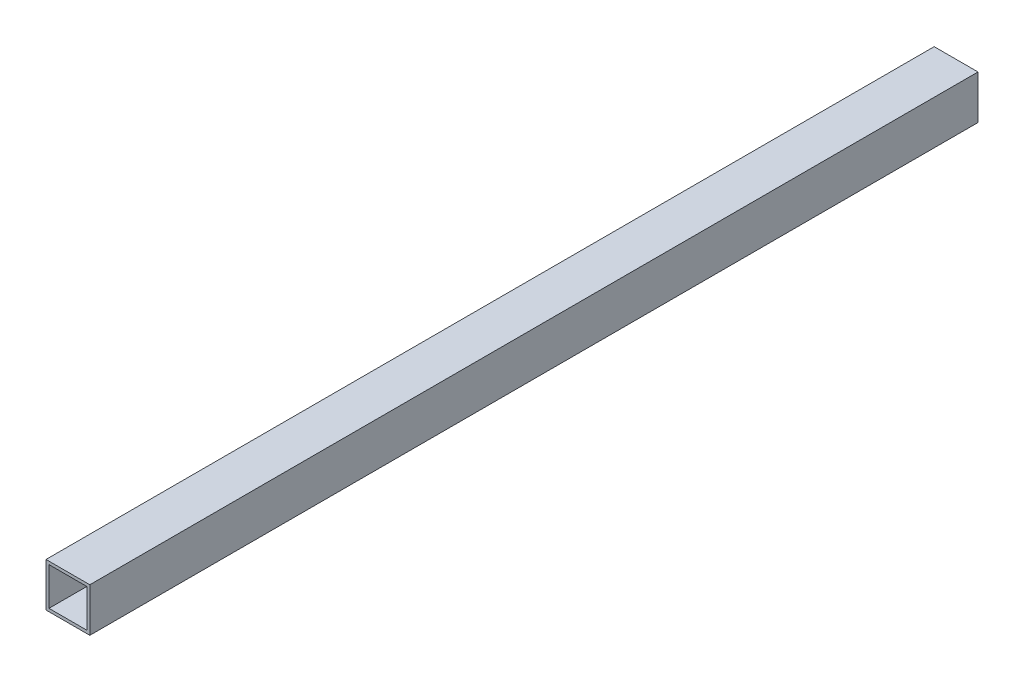
ISO-10303-21;
HEADER;
FILE_DESCRIPTION(('STEP AP214'),'2;1');
FILE_NAME('part.step','',(''),(''),'','','');
FILE_SCHEMA(('AUTOMOTIVE_DESIGN { 1 0 10303 214 1 1 1 1 }'));
ENDSEC;
DATA;
#1=APPLICATION_CONTEXT('core data for automotive mechanical design processes');
#2=APPLICATION_PROTOCOL_DEFINITION('international standard','automotive_design',2000,#1);
#3=PRODUCT_CONTEXT('',#1,'mechanical');
#4=PRODUCT('Part','Part','',(#3));
#5=PRODUCT_RELATED_PRODUCT_CATEGORY('part','',(#4));
#6=PRODUCT_DEFINITION_FORMATION('','',#4);
#7=PRODUCT_DEFINITION_CONTEXT('part definition',#1,'design');
#8=PRODUCT_DEFINITION('design','',#6,#7);
#9=PRODUCT_DEFINITION_SHAPE('','',#8);
#10=(LENGTH_UNIT() NAMED_UNIT(*) SI_UNIT(.MILLI.,.METRE.));
#11=(NAMED_UNIT(*) PLANE_ANGLE_UNIT() SI_UNIT($,.RADIAN.));
#12=(NAMED_UNIT(*) SI_UNIT($,.STERADIAN.) SOLID_ANGLE_UNIT());
#13=UNCERTAINTY_MEASURE_WITH_UNIT(LENGTH_MEASURE(1.E-05),#10,'distance_accuracy_value','');
#14=(GEOMETRIC_REPRESENTATION_CONTEXT(3) GLOBAL_UNCERTAINTY_ASSIGNED_CONTEXT((#13)) GLOBAL_UNIT_ASSIGNED_CONTEXT((#10,
#11,#12)) REPRESENTATION_CONTEXT('',''));
#15=CARTESIAN_POINT('',(0.,0.,0.));
#16=DIRECTION('',(0.,0.,1.));
#17=DIRECTION('',(1.,0.,0.));
#18=AXIS2_PLACEMENT_3D('',#15,#16,#17);
#19=CARTESIAN_POINT('',(0.,0.,300.));
#20=DIRECTION('',(0.,0.,-1.));
#21=DIRECTION('',(-1.,0.,0.));
#22=AXIS2_PLACEMENT_3D('',#19,#20,#21);
#23=PLANE('',#22);
#24=DIRECTION('',(0.,1.,0.));
#25=VECTOR('',#24,1.);
#26=CARTESIAN_POINT('',(7.4,-7.4,300.));
#27=LINE('',#26,#25);
#28=CARTESIAN_POINT('',(7.4,-7.4,300.));
#29=VERTEX_POINT('',#28);
#30=CARTESIAN_POINT('',(7.4,7.4,300.));
#31=VERTEX_POINT('',#30);
#32=EDGE_CURVE('E159',#29,#31,#27,.T.);
#33=ORIENTED_EDGE('',*,*,#32,.T.);
#34=DIRECTION('',(-1.,0.,0.));
#35=VECTOR('',#34,1.);
#36=CARTESIAN_POINT('',(-7.4,7.4,300.));
#37=LINE('',#36,#35);
#38=CARTESIAN_POINT('',(-7.4,7.4,300.));
#39=VERTEX_POINT('',#38);
#40=EDGE_CURVE('E163',#31,#39,#37,.T.);
#41=ORIENTED_EDGE('',*,*,#40,.T.);
#42=DIRECTION('',(0.,-1.,0.));
#43=VECTOR('',#42,1.);
#44=CARTESIAN_POINT('',(-7.4,-7.4,300.));
#45=LINE('',#44,#43);
#46=CARTESIAN_POINT('',(-7.4,-7.4,300.));
#47=VERTEX_POINT('',#46);
#48=EDGE_CURVE('E167',#39,#47,#45,.T.);
#49=ORIENTED_EDGE('',*,*,#48,.T.);
#50=DIRECTION('',(1.,0.,0.));
#51=VECTOR('',#50,1.);
#52=CARTESIAN_POINT('',(-7.4,-7.4,300.));
#53=LINE('',#52,#51);
#54=EDGE_CURVE('E170',#47,#29,#53,.T.);
#55=ORIENTED_EDGE('',*,*,#54,.T.);
#56=EDGE_LOOP('',(#33,#41,#49,#55));
#57=FACE_BOUND('',#56,.T.);
#58=DIRECTION('',(0.,-1.,0.));
#59=VECTOR('',#58,1.);
#60=CARTESIAN_POINT('',(-6.4,-6.4,300.));
#61=LINE('',#60,#59);
#62=CARTESIAN_POINT('',(-6.4,6.4,300.));
#63=VERTEX_POINT('',#62);
#64=CARTESIAN_POINT('',(-6.4,-6.4,300.));
#65=VERTEX_POINT('',#64);
#66=EDGE_CURVE('E111',#63,#65,#61,.T.);
#67=ORIENTED_EDGE('',*,*,#66,.F.);
#68=DIRECTION('',(-1.,0.,0.));
#69=VECTOR('',#68,1.);
#70=CARTESIAN_POINT('',(-6.4,6.4,300.));
#71=LINE('',#70,#69);
#72=CARTESIAN_POINT('',(6.4,6.4,300.));
#73=VERTEX_POINT('',#72);
#74=EDGE_CURVE('E137',#73,#63,#71,.T.);
#75=ORIENTED_EDGE('',*,*,#74,.F.);
#76=DIRECTION('',(0.,1.,0.));
#77=VECTOR('',#76,1.);
#78=CARTESIAN_POINT('',(6.4,-6.4,300.));
#79=LINE('',#78,#77);
#80=CARTESIAN_POINT('',(6.4,-6.4,300.));
#81=VERTEX_POINT('',#80);
#82=EDGE_CURVE('E133',#81,#73,#79,.T.);
#83=ORIENTED_EDGE('',*,*,#82,.F.);
#84=DIRECTION('',(1.,0.,0.));
#85=VECTOR('',#84,1.);
#86=CARTESIAN_POINT('',(-6.4,-6.4,300.));
#87=LINE('',#86,#85);
#88=EDGE_CURVE('E120',#65,#81,#87,.T.);
#89=ORIENTED_EDGE('',*,*,#88,.F.);
#90=EDGE_LOOP('',(#67,#75,#83,#89));
#91=FACE_BOUND('',#90,.T.);
#92=ADVANCED_FACE('F45',(#57,#91),#23,.F.);
#93=CARTESIAN_POINT('',(0.,0.,0.));
#94=DIRECTION('',(0.,0.,-1.));
#95=DIRECTION('',(-1.,0.,0.));
#96=AXIS2_PLACEMENT_3D('',#93,#94,#95);
#97=PLANE('',#96);
#98=DIRECTION('',(0.,1.,0.));
#99=VECTOR('',#98,1.);
#100=CARTESIAN_POINT('',(7.4,-7.4,0.));
#101=LINE('',#100,#99);
#102=CARTESIAN_POINT('',(7.4,-7.4,0.));
#103=VERTEX_POINT('',#102);
#104=CARTESIAN_POINT('',(7.4,7.4,0.));
#105=VERTEX_POINT('',#104);
#106=EDGE_CURVE('E129',#103,#105,#101,.T.);
#107=ORIENTED_EDGE('',*,*,#106,.F.);
#108=DIRECTION('',(1.,0.,0.));
#109=VECTOR('',#108,1.);
#110=CARTESIAN_POINT('',(-7.4,-7.4,0.));
#111=LINE('',#110,#109);
#112=CARTESIAN_POINT('',(-7.4,-7.4,0.));
#113=VERTEX_POINT('',#112);
#114=EDGE_CURVE('E164',#113,#103,#111,.T.);
#115=ORIENTED_EDGE('',*,*,#114,.F.);
#116=DIRECTION('',(0.,-1.,0.));
#117=VECTOR('',#116,1.);
#118=CARTESIAN_POINT('',(-7.4,-7.4,0.));
#119=LINE('',#118,#117);
#120=CARTESIAN_POINT('',(-7.4,7.4,0.));
#121=VERTEX_POINT('',#120);
#122=EDGE_CURVE('E180',#121,#113,#119,.T.);
#123=ORIENTED_EDGE('',*,*,#122,.F.);
#124=DIRECTION('',(-1.,0.,0.));
#125=VECTOR('',#124,1.);
#126=CARTESIAN_POINT('',(-7.4,7.4,0.));
#127=LINE('',#126,#125);
#128=EDGE_CURVE('E177',#105,#121,#127,.T.);
#129=ORIENTED_EDGE('',*,*,#128,.F.);
#130=EDGE_LOOP('',(#107,#115,#123,#129));
#131=FACE_BOUND('',#130,.T.);
#132=DIRECTION('',(-1.,0.,0.));
#133=VECTOR('',#132,1.);
#134=CARTESIAN_POINT('',(-6.4,6.4,0.));
#135=LINE('',#134,#133);
#136=CARTESIAN_POINT('',(6.4,6.4,0.));
#137=VERTEX_POINT('',#136);
#138=CARTESIAN_POINT('',(-6.4,6.4,0.));
#139=VERTEX_POINT('',#138);
#140=EDGE_CURVE('E121',#137,#139,#135,.T.);
#141=ORIENTED_EDGE('',*,*,#140,.T.);
#142=DIRECTION('',(0.,-1.,0.));
#143=VECTOR('',#142,1.);
#144=CARTESIAN_POINT('',(-6.4,-6.4,0.));
#145=LINE('',#144,#143);
#146=CARTESIAN_POINT('',(-6.4,-6.4,0.));
#147=VERTEX_POINT('',#146);
#148=EDGE_CURVE('E69',#139,#147,#145,.T.);
#149=ORIENTED_EDGE('',*,*,#148,.T.);
#150=DIRECTION('',(1.,0.,0.));
#151=VECTOR('',#150,1.);
#152=CARTESIAN_POINT('',(-6.4,-6.4,0.));
#153=LINE('',#152,#151);
#154=CARTESIAN_POINT('',(6.4,-6.4,0.));
#155=VERTEX_POINT('',#154);
#156=EDGE_CURVE('E127',#147,#155,#153,.T.);
#157=ORIENTED_EDGE('',*,*,#156,.T.);
#158=DIRECTION('',(0.,1.,0.));
#159=VECTOR('',#158,1.);
#160=CARTESIAN_POINT('',(6.4,-6.4,0.));
#161=LINE('',#160,#159);
#162=EDGE_CURVE('E146',#155,#137,#161,.T.);
#163=ORIENTED_EDGE('',*,*,#162,.T.);
#164=EDGE_LOOP('',(#141,#149,#157,#163));
#165=FACE_BOUND('',#164,.T.);
#166=ADVANCED_FACE('F203',(#131,#165),#97,.T.);
#167=CARTESIAN_POINT('',(7.4,-7.4,300.));
#168=DIRECTION('',(-1.,0.,0.));
#169=DIRECTION('',(0.,0.,1.));
#170=AXIS2_PLACEMENT_3D('',#167,#168,#169);
#171=PLANE('',#170);
#172=ORIENTED_EDGE('',*,*,#106,.T.);
#173=DIRECTION('',(0.,0.,-1.));
#174=VECTOR('',#173,1.);
#175=CARTESIAN_POINT('',(7.4,7.4,300.));
#176=LINE('',#175,#174);
#177=EDGE_CURVE('E11',#31,#105,#176,.T.);
#178=ORIENTED_EDGE('',*,*,#177,.F.);
#179=ORIENTED_EDGE('',*,*,#32,.F.);
#180=DIRECTION('',(0.,0.,-1.));
#181=VECTOR('',#180,1.);
#182=CARTESIAN_POINT('',(7.4,-7.4,300.));
#183=LINE('',#182,#181);
#184=EDGE_CURVE('E173',#29,#103,#183,.T.);
#185=ORIENTED_EDGE('',*,*,#184,.T.);
#186=EDGE_LOOP('',(#172,#178,#179,#185));
#187=FACE_BOUND('',#186,.T.);
#188=ADVANCED_FACE('F47',(#187),#171,.F.);
#189=CARTESIAN_POINT('',(-7.4,7.4,300.));
#190=DIRECTION('',(0.,-1.,0.));
#191=DIRECTION('',(0.,0.,-1.));
#192=AXIS2_PLACEMENT_3D('',#189,#190,#191);
#193=PLANE('',#192);
#194=ORIENTED_EDGE('',*,*,#128,.T.);
#195=DIRECTION('',(0.,0.,-1.));
#196=VECTOR('',#195,1.);
#197=CARTESIAN_POINT('',(-7.4,7.4,300.));
#198=LINE('',#197,#196);
#199=EDGE_CURVE('E54',#39,#121,#198,.T.);
#200=ORIENTED_EDGE('',*,*,#199,.F.);
#201=ORIENTED_EDGE('',*,*,#40,.F.);
#202=ORIENTED_EDGE('',*,*,#177,.T.);
#203=EDGE_LOOP('',(#194,#200,#201,#202));
#204=FACE_BOUND('',#203,.T.);
#205=ADVANCED_FACE('F213',(#204),#193,.F.);
#206=CARTESIAN_POINT('',(-7.4,-7.4,300.));
#207=DIRECTION('',(1.,0.,0.));
#208=DIRECTION('',(0.,0.,-1.));
#209=AXIS2_PLACEMENT_3D('',#206,#207,#208);
#210=PLANE('',#209);
#211=ORIENTED_EDGE('',*,*,#122,.T.);
#212=DIRECTION('',(0.,0.,-1.));
#213=VECTOR('',#212,1.);
#214=CARTESIAN_POINT('',(-7.4,-7.4,300.));
#215=LINE('',#214,#213);
#216=EDGE_CURVE('E188',#47,#113,#215,.T.);
#217=ORIENTED_EDGE('',*,*,#216,.F.);
#218=ORIENTED_EDGE('',*,*,#48,.F.);
#219=ORIENTED_EDGE('',*,*,#199,.T.);
#220=EDGE_LOOP('',(#211,#217,#218,#219));
#221=FACE_BOUND('',#220,.T.);
#222=ADVANCED_FACE('F197',(#221),#210,.F.);
#223=CARTESIAN_POINT('',(-7.4,-7.4,300.));
#224=DIRECTION('',(0.,1.,0.));
#225=DIRECTION('',(0.,0.,1.));
#226=AXIS2_PLACEMENT_3D('',#223,#224,#225);
#227=PLANE('',#226);
#228=ORIENTED_EDGE('',*,*,#114,.T.);
#229=ORIENTED_EDGE('',*,*,#184,.F.);
#230=ORIENTED_EDGE('',*,*,#54,.F.);
#231=ORIENTED_EDGE('',*,*,#216,.T.);
#232=EDGE_LOOP('',(#228,#229,#230,#231));
#233=FACE_BOUND('',#232,.T.);
#234=ADVANCED_FACE('F207',(#233),#227,.F.);
#235=CARTESIAN_POINT('',(-6.4,-6.4,300.));
#236=DIRECTION('',(1.,0.,0.));
#237=DIRECTION('',(0.,0.,-1.));
#238=AXIS2_PLACEMENT_3D('',#235,#236,#237);
#239=PLANE('',#238);
#240=ORIENTED_EDGE('',*,*,#148,.F.);
#241=DIRECTION('',(0.,0.,-1.));
#242=VECTOR('',#241,1.);
#243=CARTESIAN_POINT('',(-6.4,6.4,300.));
#244=LINE('',#243,#242);
#245=EDGE_CURVE('E115',#63,#139,#244,.T.);
#246=ORIENTED_EDGE('',*,*,#245,.F.);
#247=ORIENTED_EDGE('',*,*,#66,.T.);
#248=DIRECTION('',(0.,0.,-1.));
#249=VECTOR('',#248,1.);
#250=CARTESIAN_POINT('',(-6.4,-6.4,300.));
#251=LINE('',#250,#249);
#252=EDGE_CURVE('E114',#65,#147,#251,.T.);
#253=ORIENTED_EDGE('',*,*,#252,.T.);
#254=EDGE_LOOP('',(#240,#246,#247,#253));
#255=FACE_BOUND('',#254,.T.);
#256=ADVANCED_FACE('F113',(#255),#239,.T.);
#257=CARTESIAN_POINT('',(-6.4,-6.4,300.));
#258=DIRECTION('',(0.,1.,0.));
#259=DIRECTION('',(0.,0.,1.));
#260=AXIS2_PLACEMENT_3D('',#257,#258,#259);
#261=PLANE('',#260);
#262=ORIENTED_EDGE('',*,*,#156,.F.);
#263=ORIENTED_EDGE('',*,*,#252,.F.);
#264=ORIENTED_EDGE('',*,*,#88,.T.);
#265=DIRECTION('',(0.,0.,-1.));
#266=VECTOR('',#265,1.);
#267=CARTESIAN_POINT('',(6.4,-6.4,300.));
#268=LINE('',#267,#266);
#269=EDGE_CURVE('E130',#81,#155,#268,.T.);
#270=ORIENTED_EDGE('',*,*,#269,.T.);
#271=EDGE_LOOP('',(#262,#263,#264,#270));
#272=FACE_BOUND('',#271,.T.);
#273=ADVANCED_FACE('F124',(#272),#261,.T.);
#274=CARTESIAN_POINT('',(6.4,-6.4,300.));
#275=DIRECTION('',(-1.,0.,0.));
#276=DIRECTION('',(0.,-1.,0.));
#277=AXIS2_PLACEMENT_3D('',#274,#275,#276);
#278=PLANE('',#277);
#279=ORIENTED_EDGE('',*,*,#162,.F.);
#280=ORIENTED_EDGE('',*,*,#269,.F.);
#281=ORIENTED_EDGE('',*,*,#82,.T.);
#282=DIRECTION('',(0.,0.,-1.));
#283=VECTOR('',#282,1.);
#284=CARTESIAN_POINT('',(6.4,6.4,300.));
#285=LINE('',#284,#283);
#286=EDGE_CURVE('E61',#73,#137,#285,.T.);
#287=ORIENTED_EDGE('',*,*,#286,.T.);
#288=EDGE_LOOP('',(#279,#280,#281,#287));
#289=FACE_BOUND('',#288,.T.);
#290=ADVANCED_FACE('F236',(#289),#278,.T.);
#291=CARTESIAN_POINT('',(-6.4,6.4,300.));
#292=DIRECTION('',(0.,-1.,0.));
#293=DIRECTION('',(1.,0.,0.));
#294=AXIS2_PLACEMENT_3D('',#291,#292,#293);
#295=PLANE('',#294);
#296=ORIENTED_EDGE('',*,*,#140,.F.);
#297=ORIENTED_EDGE('',*,*,#286,.F.);
#298=ORIENTED_EDGE('',*,*,#74,.T.);
#299=ORIENTED_EDGE('',*,*,#245,.T.);
#300=EDGE_LOOP('',(#296,#297,#298,#299));
#301=FACE_BOUND('',#300,.T.);
#302=ADVANCED_FACE('F240',(#301),#295,.T.);
#303=CLOSED_SHELL('',(#92,#166,#188,#205,#222,#234,#256,#273,#290,#302));
#304=MANIFOLD_SOLID_BREP('B2',#303);
#305=ADVANCED_BREP_SHAPE_REPRESENTATION('',(#18,#304),#14);
#306=SHAPE_DEFINITION_REPRESENTATION(#9,#305);
ENDSEC;
END-ISO-10303-21;
